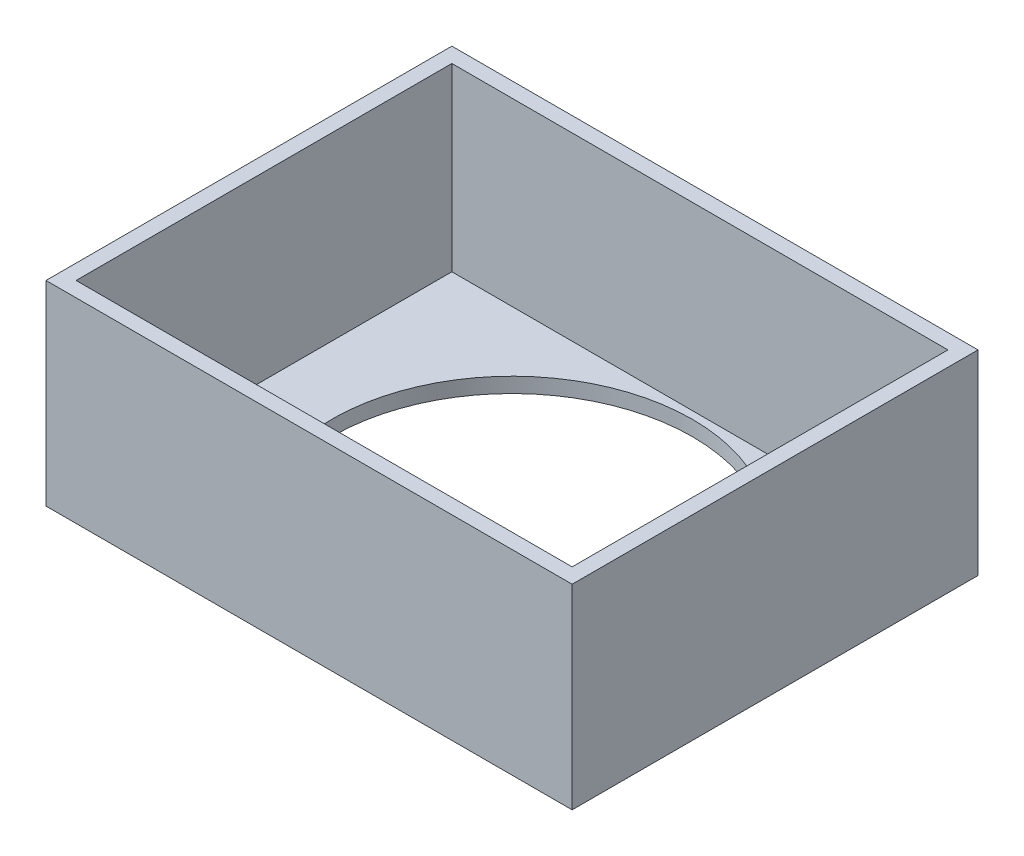
ISO-10303-21;
HEADER;
FILE_DESCRIPTION(('STEP AP214'),'2;1');
FILE_NAME('part.step','',(''),(''),'','','');
FILE_SCHEMA(('AUTOMOTIVE_DESIGN { 1 0 10303 214 1 1 1 1 }'));
ENDSEC;
DATA;
#1=APPLICATION_CONTEXT('core data for automotive mechanical design processes');
#2=APPLICATION_PROTOCOL_DEFINITION('international standard','automotive_design',2000,#1);
#3=PRODUCT_CONTEXT('',#1,'mechanical');
#4=PRODUCT('Part','Part','',(#3));
#5=PRODUCT_RELATED_PRODUCT_CATEGORY('part','',(#4));
#6=PRODUCT_DEFINITION_FORMATION('','',#4);
#7=PRODUCT_DEFINITION_CONTEXT('part definition',#1,'design');
#8=PRODUCT_DEFINITION('design','',#6,#7);
#9=PRODUCT_DEFINITION_SHAPE('','',#8);
#10=(LENGTH_UNIT() NAMED_UNIT(*) SI_UNIT(.MILLI.,.METRE.));
#11=(NAMED_UNIT(*) PLANE_ANGLE_UNIT() SI_UNIT($,.RADIAN.));
#12=(NAMED_UNIT(*) SI_UNIT($,.STERADIAN.) SOLID_ANGLE_UNIT());
#13=UNCERTAINTY_MEASURE_WITH_UNIT(LENGTH_MEASURE(1.E-05),#10,'distance_accuracy_value','');
#14=(GEOMETRIC_REPRESENTATION_CONTEXT(3) GLOBAL_UNCERTAINTY_ASSIGNED_CONTEXT((#13)) GLOBAL_UNIT_ASSIGNED_CONTEXT((#10,
#11,#12)) REPRESENTATION_CONTEXT('',''));
#15=CARTESIAN_POINT('',(0.,0.,0.));
#16=DIRECTION('',(0.,0.,1.));
#17=DIRECTION('',(1.,0.,0.));
#18=AXIS2_PLACEMENT_3D('',#15,#16,#17);
#19=CARTESIAN_POINT('',(0.,0.,0.));
#20=DIRECTION('',(0.,1.,0.));
#21=DIRECTION('',(0.,0.,1.));
#22=AXIS2_PLACEMENT_3D('',#19,#20,#21);
#23=PLANE('',#22);
#24=DIRECTION('',(0.,0.,1.));
#25=VECTOR('',#24,1.);
#26=CARTESIAN_POINT('',(-17.5,0.,13.5));
#27=LINE('',#26,#25);
#28=CARTESIAN_POINT('',(-17.5,0.,-13.5));
#29=VERTEX_POINT('',#28);
#30=CARTESIAN_POINT('',(-17.5,0.,13.5));
#31=VERTEX_POINT('',#30);
#32=EDGE_CURVE('E117',#29,#31,#27,.T.);
#33=ORIENTED_EDGE('',*,*,#32,.F.);
#34=DIRECTION('',(-1.,0.,0.));
#35=VECTOR('',#34,1.);
#36=CARTESIAN_POINT('',(17.5,0.,-13.5));
#37=LINE('',#36,#35);
#38=CARTESIAN_POINT('',(17.5,0.,-13.5));
#39=VERTEX_POINT('',#38);
#40=EDGE_CURVE('E79',#39,#29,#37,.T.);
#41=ORIENTED_EDGE('',*,*,#40,.F.);
#42=DIRECTION('',(0.,0.,-1.));
#43=VECTOR('',#42,1.);
#44=CARTESIAN_POINT('',(17.5,0.,13.5));
#45=LINE('',#44,#43);
#46=CARTESIAN_POINT('',(17.5,0.,13.5));
#47=VERTEX_POINT('',#46);
#48=EDGE_CURVE('E155',#47,#39,#45,.T.);
#49=ORIENTED_EDGE('',*,*,#48,.F.);
#50=DIRECTION('',(1.,0.,0.));
#51=VECTOR('',#50,1.);
#52=CARTESIAN_POINT('',(17.5,0.,13.5));
#53=LINE('',#52,#51);
#54=EDGE_CURVE('E153',#31,#47,#53,.T.);
#55=ORIENTED_EDGE('',*,*,#54,.F.);
#56=EDGE_LOOP('',(#33,#41,#49,#55));
#57=FACE_BOUND('',#56,.T.);
#58=CARTESIAN_POINT('',(0.,0.,0.));
#59=DIRECTION('',(0.,1.,0.));
#60=DIRECTION('',(0.,0.,1.));
#61=AXIS2_PLACEMENT_3D('',#58,#59,#60);
#62=CIRCLE('',#61,12.);
#63=CARTESIAN_POINT('',(0.,0.,-12.));
#64=VERTEX_POINT('',#63);
#65=EDGE_CURVE('E135',#64,#64,#62,.T.);
#66=ORIENTED_EDGE('',*,*,#65,.T.);
#67=EDGE_LOOP('',(#66));
#68=FACE_BOUND('',#67,.T.);
#69=ADVANCED_FACE('F33',(#57,#68),#23,.F.);
#70=CARTESIAN_POINT('',(0.,1.,0.));
#71=DIRECTION('',(0.,1.,0.));
#72=DIRECTION('',(0.,0.,1.));
#73=AXIS2_PLACEMENT_3D('',#70,#71,#72);
#74=PLANE('',#73);
#75=DIRECTION('',(0.,0.,1.));
#76=VECTOR('',#75,1.);
#77=CARTESIAN_POINT('',(-16.5,1.,-12.5));
#78=LINE('',#77,#76);
#79=CARTESIAN_POINT('',(-16.5,1.,-12.5));
#80=VERTEX_POINT('',#79);
#81=CARTESIAN_POINT('',(-16.5,1.,12.5));
#82=VERTEX_POINT('',#81);
#83=EDGE_CURVE('E114',#80,#82,#78,.T.);
#84=ORIENTED_EDGE('',*,*,#83,.T.);
#85=DIRECTION('',(1.,0.,0.));
#86=VECTOR('',#85,1.);
#87=CARTESIAN_POINT('',(-16.5,1.,12.5));
#88=LINE('',#87,#86);
#89=CARTESIAN_POINT('',(16.5,1.,12.5));
#90=VERTEX_POINT('',#89);
#91=EDGE_CURVE('E121',#82,#90,#88,.T.);
#92=ORIENTED_EDGE('',*,*,#91,.T.);
#93=DIRECTION('',(0.,0.,-1.));
#94=VECTOR('',#93,1.);
#95=CARTESIAN_POINT('',(16.5,1.,-12.5));
#96=LINE('',#95,#94);
#97=CARTESIAN_POINT('',(16.5,1.,-12.5));
#98=VERTEX_POINT('',#97);
#99=EDGE_CURVE('E127',#90,#98,#96,.T.);
#100=ORIENTED_EDGE('',*,*,#99,.T.);
#101=DIRECTION('',(-1.,0.,0.));
#102=VECTOR('',#101,1.);
#103=CARTESIAN_POINT('',(-16.5,1.,-12.5));
#104=LINE('',#103,#102);
#105=EDGE_CURVE('E132',#98,#80,#104,.T.);
#106=ORIENTED_EDGE('',*,*,#105,.T.);
#107=EDGE_LOOP('',(#84,#92,#100,#106));
#108=FACE_BOUND('',#107,.T.);
#109=CARTESIAN_POINT('',(0.,0.999999999999999,0.));
#110=DIRECTION('',(0.,1.,0.));
#111=DIRECTION('',(0.,0.,1.));
#112=AXIS2_PLACEMENT_3D('',#109,#110,#111);
#113=CIRCLE('',#112,12.);
#114=CARTESIAN_POINT('',(0.,0.999999999999997,-12.));
#115=VERTEX_POINT('',#114);
#116=EDGE_CURVE('E37',#115,#115,#113,.F.);
#117=ORIENTED_EDGE('',*,*,#116,.T.);
#118=EDGE_LOOP('',(#117));
#119=FACE_BOUND('',#118,.T.);
#120=ADVANCED_FACE('F130',(#108,#119),#74,.T.);
#121=CARTESIAN_POINT('',(0.,13.,0.));
#122=DIRECTION('',(0.,1.,0.));
#123=DIRECTION('',(0.,0.,1.));
#124=AXIS2_PLACEMENT_3D('',#121,#122,#123);
#125=PLANE('',#124);
#126=DIRECTION('',(0.,0.,1.));
#127=VECTOR('',#126,1.);
#128=CARTESIAN_POINT('',(-17.5,13.,13.5));
#129=LINE('',#128,#127);
#130=CARTESIAN_POINT('',(-17.5,13.,-13.5));
#131=VERTEX_POINT('',#130);
#132=CARTESIAN_POINT('',(-17.5,13.,13.5));
#133=VERTEX_POINT('',#132);
#134=EDGE_CURVE('E144',#131,#133,#129,.T.);
#135=ORIENTED_EDGE('',*,*,#134,.T.);
#136=DIRECTION('',(1.,0.,0.));
#137=VECTOR('',#136,1.);
#138=CARTESIAN_POINT('',(17.5,13.,13.5));
#139=LINE('',#138,#137);
#140=CARTESIAN_POINT('',(17.5,13.,13.5));
#141=VERTEX_POINT('',#140);
#142=EDGE_CURVE('E87',#133,#141,#139,.T.);
#143=ORIENTED_EDGE('',*,*,#142,.T.);
#144=DIRECTION('',(0.,0.,-1.));
#145=VECTOR('',#144,1.);
#146=CARTESIAN_POINT('',(17.5,13.,13.5));
#147=LINE('',#146,#145);
#148=CARTESIAN_POINT('',(17.5,13.,-13.5));
#149=VERTEX_POINT('',#148);
#150=EDGE_CURVE('E147',#141,#149,#147,.T.);
#151=ORIENTED_EDGE('',*,*,#150,.T.);
#152=DIRECTION('',(-1.,0.,0.));
#153=VECTOR('',#152,1.);
#154=CARTESIAN_POINT('',(17.5,13.,-13.5));
#155=LINE('',#154,#153);
#156=EDGE_CURVE('E58',#149,#131,#155,.T.);
#157=ORIENTED_EDGE('',*,*,#156,.T.);
#158=EDGE_LOOP('',(#135,#143,#151,#157));
#159=FACE_BOUND('',#158,.T.);
#160=DIRECTION('',(-1.,0.,0.));
#161=VECTOR('',#160,1.);
#162=CARTESIAN_POINT('',(0.,13.,12.5));
#163=LINE('',#162,#161);
#164=CARTESIAN_POINT('',(16.5,13.,12.5));
#165=VERTEX_POINT('',#164);
#166=CARTESIAN_POINT('',(-16.5,13.,12.5));
#167=VERTEX_POINT('',#166);
#168=EDGE_CURVE('E42',#165,#167,#163,.T.);
#169=ORIENTED_EDGE('',*,*,#168,.T.);
#170=DIRECTION('',(0.,0.,-1.));
#171=VECTOR('',#170,1.);
#172=CARTESIAN_POINT('',(-16.5,13.,0.));
#173=LINE('',#172,#171);
#174=CARTESIAN_POINT('',(-16.5,13.,-12.5));
#175=VERTEX_POINT('',#174);
#176=EDGE_CURVE('E11',#167,#175,#173,.T.);
#177=ORIENTED_EDGE('',*,*,#176,.T.);
#178=DIRECTION('',(1.,0.,0.));
#179=VECTOR('',#178,1.);
#180=CARTESIAN_POINT('',(0.,13.,-12.5));
#181=LINE('',#180,#179);
#182=CARTESIAN_POINT('',(16.5,13.,-12.5));
#183=VERTEX_POINT('',#182);
#184=EDGE_CURVE('E166',#175,#183,#181,.T.);
#185=ORIENTED_EDGE('',*,*,#184,.T.);
#186=DIRECTION('',(0.,0.,1.));
#187=VECTOR('',#186,1.);
#188=CARTESIAN_POINT('',(16.5,13.,0.));
#189=LINE('',#188,#187);
#190=EDGE_CURVE('E169',#183,#165,#189,.T.);
#191=ORIENTED_EDGE('',*,*,#190,.T.);
#192=EDGE_LOOP('',(#169,#177,#185,#191));
#193=FACE_BOUND('',#192,.T.);
#194=ADVANCED_FACE('F173',(#159,#193),#125,.T.);
#195=CARTESIAN_POINT('',(-17.5,13.,13.5));
#196=DIRECTION('',(1.,0.,0.));
#197=DIRECTION('',(0.,0.,-1.));
#198=AXIS2_PLACEMENT_3D('',#195,#196,#197);
#199=PLANE('',#198);
#200=ORIENTED_EDGE('',*,*,#32,.T.);
#201=DIRECTION('',(0.,-1.,0.));
#202=VECTOR('',#201,1.);
#203=CARTESIAN_POINT('',(-17.5,13.,13.5));
#204=LINE('',#203,#202);
#205=EDGE_CURVE('E164',#133,#31,#204,.T.);
#206=ORIENTED_EDGE('',*,*,#205,.F.);
#207=ORIENTED_EDGE('',*,*,#134,.F.);
#208=DIRECTION('',(0.,-1.,0.));
#209=VECTOR('',#208,1.);
#210=CARTESIAN_POINT('',(-17.5,13.,-13.5));
#211=LINE('',#210,#209);
#212=EDGE_CURVE('E150',#131,#29,#211,.T.);
#213=ORIENTED_EDGE('',*,*,#212,.T.);
#214=EDGE_LOOP('',(#200,#206,#207,#213));
#215=FACE_BOUND('',#214,.T.);
#216=ADVANCED_FACE('F35',(#215),#199,.F.);
#217=CARTESIAN_POINT('',(17.5,13.,13.5));
#218=DIRECTION('',(0.,0.,-1.));
#219=DIRECTION('',(-1.,0.,0.));
#220=AXIS2_PLACEMENT_3D('',#217,#218,#219);
#221=PLANE('',#220);
#222=ORIENTED_EDGE('',*,*,#54,.T.);
#223=DIRECTION('',(0.,-1.,0.));
#224=VECTOR('',#223,1.);
#225=CARTESIAN_POINT('',(17.5,13.,13.5));
#226=LINE('',#225,#224);
#227=EDGE_CURVE('E161',#141,#47,#226,.T.);
#228=ORIENTED_EDGE('',*,*,#227,.F.);
#229=ORIENTED_EDGE('',*,*,#142,.F.);
#230=ORIENTED_EDGE('',*,*,#205,.T.);
#231=EDGE_LOOP('',(#222,#228,#229,#230));
#232=FACE_BOUND('',#231,.T.);
#233=ADVANCED_FACE('F204',(#232),#221,.F.);
#234=CARTESIAN_POINT('',(17.5,13.,13.5));
#235=DIRECTION('',(-1.,0.,0.));
#236=DIRECTION('',(0.,0.,1.));
#237=AXIS2_PLACEMENT_3D('',#234,#235,#236);
#238=PLANE('',#237);
#239=ORIENTED_EDGE('',*,*,#48,.T.);
#240=DIRECTION('',(0.,-1.,0.));
#241=VECTOR('',#240,1.);
#242=CARTESIAN_POINT('',(17.5,13.,-13.5));
#243=LINE('',#242,#241);
#244=EDGE_CURVE('E159',#149,#39,#243,.T.);
#245=ORIENTED_EDGE('',*,*,#244,.F.);
#246=ORIENTED_EDGE('',*,*,#150,.F.);
#247=ORIENTED_EDGE('',*,*,#227,.T.);
#248=EDGE_LOOP('',(#239,#245,#246,#247));
#249=FACE_BOUND('',#248,.T.);
#250=ADVANCED_FACE('F202',(#249),#238,.F.);
#251=CARTESIAN_POINT('',(17.5,13.,-13.5));
#252=DIRECTION('',(0.,0.,1.));
#253=DIRECTION('',(1.,0.,0.));
#254=AXIS2_PLACEMENT_3D('',#251,#252,#253);
#255=PLANE('',#254);
#256=ORIENTED_EDGE('',*,*,#40,.T.);
#257=ORIENTED_EDGE('',*,*,#212,.F.);
#258=ORIENTED_EDGE('',*,*,#156,.F.);
#259=ORIENTED_EDGE('',*,*,#244,.T.);
#260=EDGE_LOOP('',(#256,#257,#258,#259));
#261=FACE_BOUND('',#260,.T.);
#262=ADVANCED_FACE('F199',(#261),#255,.F.);
#263=CARTESIAN_POINT('',(-16.5,16.,-12.5));
#264=DIRECTION('',(1.,0.,0.));
#265=DIRECTION('',(0.,0.,-1.));
#266=AXIS2_PLACEMENT_3D('',#263,#264,#265);
#267=PLANE('',#266);
#268=DIRECTION('',(0.,-1.,0.));
#269=VECTOR('',#268,1.);
#270=CARTESIAN_POINT('',(-16.5,16.,12.5));
#271=LINE('',#270,#269);
#272=EDGE_CURVE('E109',#167,#82,#271,.T.);
#273=ORIENTED_EDGE('',*,*,#272,.T.);
#274=ORIENTED_EDGE('',*,*,#83,.F.);
#275=DIRECTION('',(0.,-1.,0.));
#276=VECTOR('',#275,1.);
#277=CARTESIAN_POINT('',(-16.5,16.,-12.5));
#278=LINE('',#277,#276);
#279=EDGE_CURVE('E140',#175,#80,#278,.T.);
#280=ORIENTED_EDGE('',*,*,#279,.F.);
#281=ORIENTED_EDGE('',*,*,#176,.F.);
#282=EDGE_LOOP('',(#273,#274,#280,#281));
#283=FACE_BOUND('',#282,.T.);
#284=ADVANCED_FACE('F111',(#283),#267,.T.);
#285=CARTESIAN_POINT('',(-16.5,16.,12.5));
#286=DIRECTION('',(0.,0.,-1.));
#287=DIRECTION('',(-1.,0.,0.));
#288=AXIS2_PLACEMENT_3D('',#285,#286,#287);
#289=PLANE('',#288);
#290=DIRECTION('',(0.,-1.,0.));
#291=VECTOR('',#290,1.);
#292=CARTESIAN_POINT('',(16.5,16.,12.5));
#293=LINE('',#292,#291);
#294=EDGE_CURVE('E118',#165,#90,#293,.T.);
#295=ORIENTED_EDGE('',*,*,#294,.T.);
#296=ORIENTED_EDGE('',*,*,#91,.F.);
#297=ORIENTED_EDGE('',*,*,#272,.F.);
#298=ORIENTED_EDGE('',*,*,#168,.F.);
#299=EDGE_LOOP('',(#295,#296,#297,#298));
#300=FACE_BOUND('',#299,.T.);
#301=ADVANCED_FACE('F122',(#300),#289,.T.);
#302=CARTESIAN_POINT('',(16.5,16.,-12.5));
#303=DIRECTION('',(-1.,0.,0.));
#304=DIRECTION('',(0.,0.,1.));
#305=AXIS2_PLACEMENT_3D('',#302,#303,#304);
#306=PLANE('',#305);
#307=DIRECTION('',(0.,-1.,0.));
#308=VECTOR('',#307,1.);
#309=CARTESIAN_POINT('',(16.5,16.,-12.5));
#310=LINE('',#309,#308);
#311=EDGE_CURVE('E49',#183,#98,#310,.T.);
#312=ORIENTED_EDGE('',*,*,#311,.T.);
#313=ORIENTED_EDGE('',*,*,#99,.F.);
#314=ORIENTED_EDGE('',*,*,#294,.F.);
#315=ORIENTED_EDGE('',*,*,#190,.F.);
#316=EDGE_LOOP('',(#312,#313,#314,#315));
#317=FACE_BOUND('',#316,.T.);
#318=ADVANCED_FACE('F175',(#317),#306,.T.);
#319=CARTESIAN_POINT('',(-16.5,16.,-12.5));
#320=DIRECTION('',(0.,0.,1.));
#321=DIRECTION('',(1.,0.,0.));
#322=AXIS2_PLACEMENT_3D('',#319,#320,#321);
#323=PLANE('',#322);
#324=ORIENTED_EDGE('',*,*,#279,.T.);
#325=ORIENTED_EDGE('',*,*,#105,.F.);
#326=ORIENTED_EDGE('',*,*,#311,.F.);
#327=ORIENTED_EDGE('',*,*,#184,.F.);
#328=EDGE_LOOP('',(#324,#325,#326,#327));
#329=FACE_BOUND('',#328,.T.);
#330=ADVANCED_FACE('F176',(#329),#323,.T.);
#331=CARTESIAN_POINT('',(0.,13.,0.));
#332=DIRECTION('',(0.,-1.,0.));
#333=DIRECTION('',(0.,0.,-1.));
#334=AXIS2_PLACEMENT_3D('',#331,#332,#333);
#335=CYLINDRICAL_SURFACE('',#334,12.);
#336=CARTESIAN_POINT('',(0.,0.999999999999997,-12.));
#337=CARTESIAN_POINT('',(0.,0.989583333333331,-12.));
#338=CARTESIAN_POINT('',(0.,0.979166666666664,-12.));
#339=CARTESIAN_POINT('',(0.,0.958333333333331,-12.));
#340=CARTESIAN_POINT('',(0.,0.947916666666664,-12.));
#341=CARTESIAN_POINT('',(0.,0.927083333333331,-12.));
#342=CARTESIAN_POINT('',(0.,0.916666666666664,-12.));
#343=CARTESIAN_POINT('',(0.,0.895833333333331,-12.));
#344=CARTESIAN_POINT('',(0.,0.885416666666664,-12.));
#345=CARTESIAN_POINT('',(0.,0.864583333333331,-12.));
#346=CARTESIAN_POINT('',(0.,0.854166666666664,-12.));
#347=CARTESIAN_POINT('',(0.,0.833333333333331,-12.));
#348=CARTESIAN_POINT('',(0.,0.822916666666664,-12.));
#349=CARTESIAN_POINT('',(0.,0.802083333333331,-12.));
#350=CARTESIAN_POINT('',(0.,0.791666666666664,-12.));
#351=CARTESIAN_POINT('',(0.,0.77083333333333,-12.));
#352=CARTESIAN_POINT('',(0.,0.760416666666664,-12.));
#353=CARTESIAN_POINT('',(0.,0.739583333333331,-12.));
#354=CARTESIAN_POINT('',(0.,0.729166666666665,-12.));
#355=CARTESIAN_POINT('',(0.,0.708333333333332,-12.));
#356=CARTESIAN_POINT('',(0.,0.697916666666666,-12.));
#357=CARTESIAN_POINT('',(0.,0.677083333333332,-12.));
#358=CARTESIAN_POINT('',(0.,0.666666666666666,-12.));
#359=CARTESIAN_POINT('',(0.,0.645833333333332,-12.));
#360=CARTESIAN_POINT('',(0.,0.635416666666666,-12.));
#361=CARTESIAN_POINT('',(0.,0.614583333333332,-12.));
#362=CARTESIAN_POINT('',(0.,0.604166666666666,-12.));
#363=CARTESIAN_POINT('',(0.,0.583333333333332,-12.));
#364=CARTESIAN_POINT('',(0.,0.572916666666666,-12.));
#365=CARTESIAN_POINT('',(0.,0.552083333333332,-12.));
#366=CARTESIAN_POINT('',(0.,0.541666666666665,-12.));
#367=CARTESIAN_POINT('',(0.,0.520833333333332,-12.));
#368=CARTESIAN_POINT('',(0.,0.510416666666665,-12.));
#369=CARTESIAN_POINT('',(0.,0.489583333333332,-12.));
#370=CARTESIAN_POINT('',(0.,0.479166666666665,-12.));
#371=CARTESIAN_POINT('',(0.,0.458333333333332,-12.));
#372=CARTESIAN_POINT('',(0.,0.447916666666665,-12.));
#373=CARTESIAN_POINT('',(0.,0.427083333333332,-12.));
#374=CARTESIAN_POINT('',(0.,0.416666666666665,-12.));
#375=CARTESIAN_POINT('',(0.,0.395833333333332,-12.));
#376=CARTESIAN_POINT('',(0.,0.385416666666665,-12.));
#377=CARTESIAN_POINT('',(0.,0.364583333333332,-12.));
#378=CARTESIAN_POINT('',(0.,0.354166666666665,-12.));
#379=CARTESIAN_POINT('',(0.,0.333333333333332,-12.));
#380=CARTESIAN_POINT('',(0.,0.322916666666665,-12.));
#381=CARTESIAN_POINT('',(0.,0.302083333333332,-12.));
#382=CARTESIAN_POINT('',(0.,0.291666666666665,-12.));
#383=CARTESIAN_POINT('',(0.,0.270833333333332,-12.));
#384=CARTESIAN_POINT('',(0.,0.260416666666666,-12.));
#385=CARTESIAN_POINT('',(0.,0.239583333333334,-12.));
#386=CARTESIAN_POINT('',(0.,0.229166666666667,-12.));
#387=CARTESIAN_POINT('',(0.,0.208333333333334,-12.));
#388=CARTESIAN_POINT('',(0.,0.197916666666667,-12.));
#389=CARTESIAN_POINT('',(0.,0.177083333333333,-12.));
#390=CARTESIAN_POINT('',(0.,0.166666666666667,-12.));
#391=CARTESIAN_POINT('',(0.,0.145833333333333,-12.));
#392=CARTESIAN_POINT('',(0.,0.135416666666667,-12.));
#393=CARTESIAN_POINT('',(0.,0.114583333333333,-12.));
#394=CARTESIAN_POINT('',(0.,0.104166666666667,-12.));
#395=CARTESIAN_POINT('',(0.,0.0833333333333334,-12.));
#396=CARTESIAN_POINT('',(0.,0.0729166666666667,-12.));
#397=CARTESIAN_POINT('',(0.,0.0520833333333334,-12.));
#398=CARTESIAN_POINT('',(0.,0.0416666666666667,-12.));
#399=CARTESIAN_POINT('',(0.,0.0208333333333333,-12.));
#400=CARTESIAN_POINT('',(0.,0.0104166666666667,-12.));
#401=CARTESIAN_POINT('',(0.,0.,-12.));
#402=B_SPLINE_CURVE_WITH_KNOTS('',3,(#336,#337,#338,#339,#340,#341,#342,#343,#344,#345,#346,
#347,#348,#349,#350,#351,#352,#353,#354,#355,#356,#357,#358,#359,#360,#361,#362,#363,#364,#365,
#366,#367,#368,#369,#370,#371,#372,#373,#374,#375,#376,#377,#378,#379,#380,#381,#382,#383,#384,
#385,#386,#387,#388,#389,#390,#391,#392,#393,#394,#395,#396,#397,#398,#399,#400,#401),
.UNSPECIFIED.,.F.,.F.,(4,2,2,2,2,2,2,2,2,2,2,2,2,2,2,2,2,2,2,2,2,2,2,2,2,2,2,2,2,2,2,2,4),(0.,
0.03125,0.0625000000000001,0.0937500000000001,0.125,0.15625,0.1875,0.21875,0.25,
0.281249999999999,0.312499999999999,0.343749999999999,0.374999999999999,0.406249999999999,
0.437499999999999,0.468749999999999,0.499999999999999,0.531249999999999,0.562499999999999,
0.593749999999999,0.624999999999999,0.656249999999999,0.687499999999999,0.718749999999999,
0.749999999999997,0.781249999999997,0.812499999999997,0.843749999999997,0.874999999999997,
0.906249999999997,0.937499999999997,0.968749999999997,0.999999999999997),.UNSPECIFIED.);
#403=EDGE_CURVE('BSEAM178',#115,#64,#402,.T.);
#404=ORIENTED_EDGE('',*,*,#116,.F.);
#405=ORIENTED_EDGE('',*,*,#65,.F.);
#406=ORIENTED_EDGE('',*,*,#403,.T.);
#407=ORIENTED_EDGE('',*,*,#403,.F.);
#408=EDGE_LOOP('',(#404,#406,#405,#407));
#409=FACE_BOUND('',#408,.T.);
#410=ADVANCED_FACE('F178',(#409),#335,.F.);
#411=CLOSED_SHELL('',(#69,#120,#194,#216,#233,#250,#262,#284,#301,#318,#330,#410));
#412=MANIFOLD_SOLID_BREP('B2',#411);
#413=ADVANCED_BREP_SHAPE_REPRESENTATION('',(#18,#412),#14);
#414=SHAPE_DEFINITION_REPRESENTATION(#9,#413);
ENDSEC;
END-ISO-10303-21;
